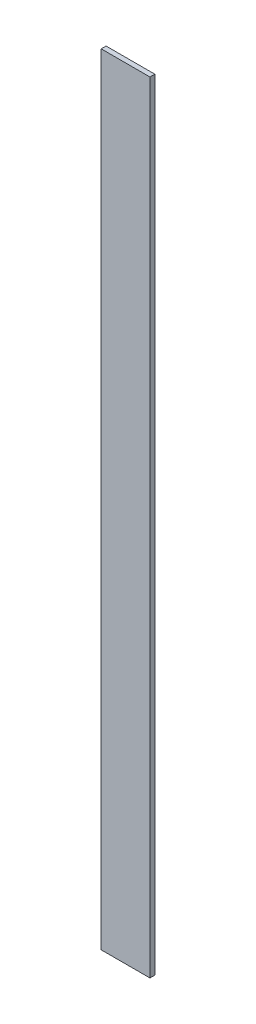
ISO-10303-21;
HEADER;
FILE_DESCRIPTION(('STEP AP214'),'2;1');
FILE_NAME('part.step','',(''),(''),'','','');
FILE_SCHEMA(('AUTOMOTIVE_DESIGN { 1 0 10303 214 1 1 1 1 }'));
ENDSEC;
DATA;
#1=APPLICATION_CONTEXT('core data for automotive mechanical design processes');
#2=APPLICATION_PROTOCOL_DEFINITION('international standard','automotive_design',2000,#1);
#3=PRODUCT_CONTEXT('',#1,'mechanical');
#4=PRODUCT('Part','Part','',(#3));
#5=PRODUCT_RELATED_PRODUCT_CATEGORY('part','',(#4));
#6=PRODUCT_DEFINITION_FORMATION('','',#4);
#7=PRODUCT_DEFINITION_CONTEXT('part definition',#1,'design');
#8=PRODUCT_DEFINITION('design','',#6,#7);
#9=PRODUCT_DEFINITION_SHAPE('','',#8);
#10=(LENGTH_UNIT() NAMED_UNIT(*) SI_UNIT(.MILLI.,.METRE.));
#11=(NAMED_UNIT(*) PLANE_ANGLE_UNIT() SI_UNIT($,.RADIAN.));
#12=(NAMED_UNIT(*) SI_UNIT($,.STERADIAN.) SOLID_ANGLE_UNIT());
#13=UNCERTAINTY_MEASURE_WITH_UNIT(LENGTH_MEASURE(1.E-05),#10,'distance_accuracy_value','');
#14=(GEOMETRIC_REPRESENTATION_CONTEXT(3) GLOBAL_UNCERTAINTY_ASSIGNED_CONTEXT((#13)) GLOBAL_UNIT_ASSIGNED_CONTEXT((#10,
#11,#12)) REPRESENTATION_CONTEXT('',''));
#15=CARTESIAN_POINT('',(0.,0.,0.));
#16=DIRECTION('',(0.,0.,1.));
#17=DIRECTION('',(1.,0.,0.));
#18=AXIS2_PLACEMENT_3D('',#15,#16,#17);
#19=CARTESIAN_POINT('',(6.35,203.2,0.635));
#20=DIRECTION('',(-1.,0.,0.));
#21=DIRECTION('',(0.,0.,1.));
#22=AXIS2_PLACEMENT_3D('',#19,#20,#21);
#23=PLANE('',#22);
#24=DIRECTION('',(0.,0.,-1.));
#25=VECTOR('',#24,1.);
#26=CARTESIAN_POINT('',(6.35,0.,0.635));
#27=LINE('',#26,#25);
#28=CARTESIAN_POINT('',(6.35,0.,0.635));
#29=VERTEX_POINT('',#28);
#30=CARTESIAN_POINT('',(6.35,0.,-0.635));
#31=VERTEX_POINT('',#30);
#32=EDGE_CURVE('E98',#29,#31,#27,.T.);
#33=ORIENTED_EDGE('',*,*,#32,.T.);
#34=DIRECTION('',(0.,-1.,0.));
#35=VECTOR('',#34,1.);
#36=CARTESIAN_POINT('',(6.35,203.2,-0.635));
#37=LINE('',#36,#35);
#38=CARTESIAN_POINT('',(6.35,203.2,-0.635));
#39=VERTEX_POINT('',#38);
#40=EDGE_CURVE('E11',#39,#31,#37,.T.);
#41=ORIENTED_EDGE('',*,*,#40,.F.);
#42=DIRECTION('',(0.,0.,-1.));
#43=VECTOR('',#42,1.);
#44=CARTESIAN_POINT('',(6.35,203.2,0.635));
#45=LINE('',#44,#43);
#46=CARTESIAN_POINT('',(6.35,203.2,0.635));
#47=VERTEX_POINT('',#46);
#48=EDGE_CURVE('E86',#47,#39,#45,.T.);
#49=ORIENTED_EDGE('',*,*,#48,.F.);
#50=DIRECTION('',(0.,-1.,0.));
#51=VECTOR('',#50,1.);
#52=CARTESIAN_POINT('',(6.35,203.2,0.635));
#53=LINE('',#52,#51);
#54=EDGE_CURVE('E94',#47,#29,#53,.T.);
#55=ORIENTED_EDGE('',*,*,#54,.T.);
#56=EDGE_LOOP('',(#33,#41,#49,#55));
#57=FACE_BOUND('',#56,.T.);
#58=ADVANCED_FACE('F35',(#57),#23,.F.);
#59=CARTESIAN_POINT('',(-6.35,203.2,-0.635));
#60=DIRECTION('',(0.,0.,1.));
#61=DIRECTION('',(1.,0.,0.));
#62=AXIS2_PLACEMENT_3D('',#59,#60,#61);
#63=PLANE('',#62);
#64=DIRECTION('',(-1.,0.,0.));
#65=VECTOR('',#64,1.);
#66=CARTESIAN_POINT('',(-6.35,0.,-0.635));
#67=LINE('',#66,#65);
#68=CARTESIAN_POINT('',(-6.35,0.,-0.635));
#69=VERTEX_POINT('',#68);
#70=EDGE_CURVE('E90',#31,#69,#67,.T.);
#71=ORIENTED_EDGE('',*,*,#70,.T.);
#72=DIRECTION('',(0.,-1.,0.));
#73=VECTOR('',#72,1.);
#74=CARTESIAN_POINT('',(-6.35,203.2,-0.635));
#75=LINE('',#74,#73);
#76=CARTESIAN_POINT('',(-6.35,203.2,-0.635));
#77=VERTEX_POINT('',#76);
#78=EDGE_CURVE('E43',#77,#69,#75,.T.);
#79=ORIENTED_EDGE('',*,*,#78,.F.);
#80=DIRECTION('',(-1.,0.,0.));
#81=VECTOR('',#80,1.);
#82=CARTESIAN_POINT('',(-6.35,203.2,-0.635));
#83=LINE('',#82,#81);
#84=EDGE_CURVE('E81',#39,#77,#83,.T.);
#85=ORIENTED_EDGE('',*,*,#84,.F.);
#86=ORIENTED_EDGE('',*,*,#40,.T.);
#87=EDGE_LOOP('',(#71,#79,#85,#86));
#88=FACE_BOUND('',#87,.T.);
#89=ADVANCED_FACE('F89',(#88),#63,.F.);
#90=CARTESIAN_POINT('',(-6.35,203.2,0.635));
#91=DIRECTION('',(1.,0.,0.));
#92=DIRECTION('',(0.,0.,-1.));
#93=AXIS2_PLACEMENT_3D('',#90,#91,#92);
#94=PLANE('',#93);
#95=DIRECTION('',(0.,0.,1.));
#96=VECTOR('',#95,1.);
#97=CARTESIAN_POINT('',(-6.35,0.,0.635));
#98=LINE('',#97,#96);
#99=CARTESIAN_POINT('',(-6.35,0.,0.635));
#100=VERTEX_POINT('',#99);
#101=EDGE_CURVE('E68',#69,#100,#98,.T.);
#102=ORIENTED_EDGE('',*,*,#101,.T.);
#103=DIRECTION('',(0.,-1.,0.));
#104=VECTOR('',#103,1.);
#105=CARTESIAN_POINT('',(-6.35,203.2,0.635));
#106=LINE('',#105,#104);
#107=CARTESIAN_POINT('',(-6.35,203.2,0.635));
#108=VERTEX_POINT('',#107);
#109=EDGE_CURVE('E91',#108,#100,#106,.T.);
#110=ORIENTED_EDGE('',*,*,#109,.F.);
#111=DIRECTION('',(0.,0.,1.));
#112=VECTOR('',#111,1.);
#113=CARTESIAN_POINT('',(-6.35,203.2,0.635));
#114=LINE('',#113,#112);
#115=EDGE_CURVE('E84',#77,#108,#114,.T.);
#116=ORIENTED_EDGE('',*,*,#115,.F.);
#117=ORIENTED_EDGE('',*,*,#78,.T.);
#118=EDGE_LOOP('',(#102,#110,#116,#117));
#119=FACE_BOUND('',#118,.T.);
#120=ADVANCED_FACE('F92',(#119),#94,.F.);
#121=CARTESIAN_POINT('',(-6.35,203.2,0.635));
#122=DIRECTION('',(0.,0.,-1.));
#123=DIRECTION('',(-1.,0.,0.));
#124=AXIS2_PLACEMENT_3D('',#121,#122,#123);
#125=PLANE('',#124);
#126=DIRECTION('',(1.,0.,0.));
#127=VECTOR('',#126,1.);
#128=CARTESIAN_POINT('',(-6.35,0.,0.635));
#129=LINE('',#128,#127);
#130=EDGE_CURVE('E74',#100,#29,#129,.T.);
#131=ORIENTED_EDGE('',*,*,#130,.T.);
#132=ORIENTED_EDGE('',*,*,#54,.F.);
#133=DIRECTION('',(1.,0.,0.));
#134=VECTOR('',#133,1.);
#135=CARTESIAN_POINT('',(-6.35,203.2,0.635));
#136=LINE('',#135,#134);
#137=EDGE_CURVE('E51',#108,#47,#136,.T.);
#138=ORIENTED_EDGE('',*,*,#137,.F.);
#139=ORIENTED_EDGE('',*,*,#109,.T.);
#140=EDGE_LOOP('',(#131,#132,#138,#139));
#141=FACE_BOUND('',#140,.T.);
#142=ADVANCED_FACE('F105',(#141),#125,.F.);
#143=CARTESIAN_POINT('',(0.,203.2,0.));
#144=DIRECTION('',(0.,-1.,0.));
#145=DIRECTION('',(0.,0.,-1.));
#146=AXIS2_PLACEMENT_3D('',#143,#144,#145);
#147=PLANE('',#146);
#148=ORIENTED_EDGE('',*,*,#48,.T.);
#149=ORIENTED_EDGE('',*,*,#84,.T.);
#150=ORIENTED_EDGE('',*,*,#115,.T.);
#151=ORIENTED_EDGE('',*,*,#137,.T.);
#152=EDGE_LOOP('',(#148,#149,#150,#151));
#153=FACE_BOUND('',#152,.T.);
#154=ADVANCED_FACE('F82',(#153),#147,.F.);
#155=CARTESIAN_POINT('',(0.,0.,0.));
#156=DIRECTION('',(0.,-1.,0.));
#157=DIRECTION('',(0.,0.,-1.));
#158=AXIS2_PLACEMENT_3D('',#155,#156,#157);
#159=PLANE('',#158);
#160=ORIENTED_EDGE('',*,*,#32,.F.);
#161=ORIENTED_EDGE('',*,*,#130,.F.);
#162=ORIENTED_EDGE('',*,*,#101,.F.);
#163=ORIENTED_EDGE('',*,*,#70,.F.);
#164=EDGE_LOOP('',(#160,#161,#162,#163));
#165=FACE_BOUND('',#164,.T.);
#166=ADVANCED_FACE('F108',(#165),#159,.T.);
#167=CLOSED_SHELL('',(#58,#89,#120,#142,#154,#166));
#168=MANIFOLD_SOLID_BREP('B2',#167);
#169=ADVANCED_BREP_SHAPE_REPRESENTATION('',(#18,#168),#14);
#170=SHAPE_DEFINITION_REPRESENTATION(#9,#169);
ENDSEC;
END-ISO-10303-21;
